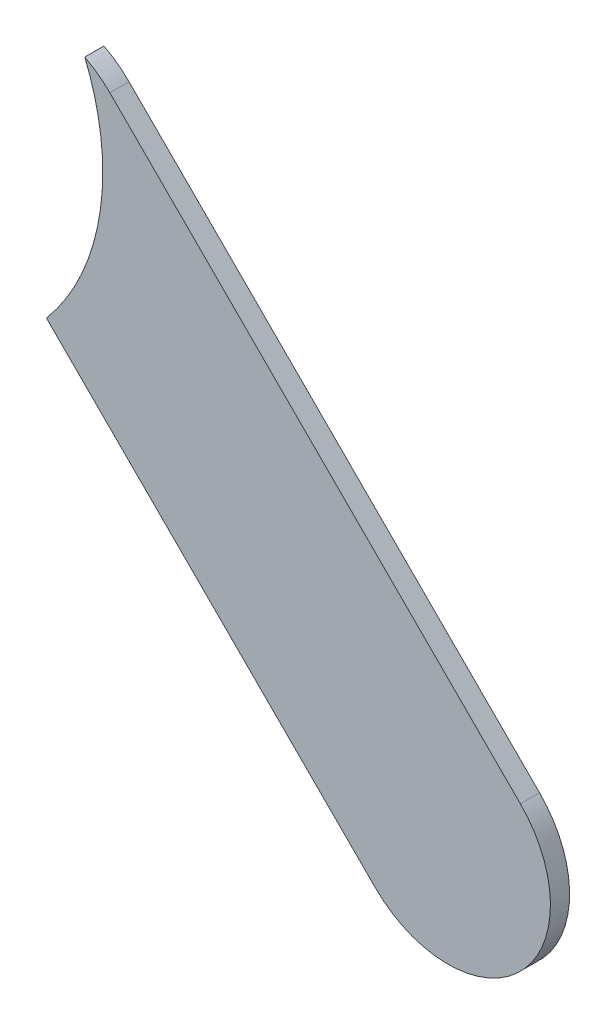
ISO-10303-21;
HEADER;
FILE_DESCRIPTION(('STEP AP214'),'2;1');
FILE_NAME('part.step','',(''),(''),'','','');
FILE_SCHEMA(('AUTOMOTIVE_DESIGN { 1 0 10303 214 1 1 1 1 }'));
ENDSEC;
DATA;
#1=APPLICATION_CONTEXT('core data for automotive mechanical design processes');
#2=APPLICATION_PROTOCOL_DEFINITION('international standard','automotive_design',2000,#1);
#3=PRODUCT_CONTEXT('',#1,'mechanical');
#4=PRODUCT('Part','Part','',(#3));
#5=PRODUCT_RELATED_PRODUCT_CATEGORY('part','',(#4));
#6=PRODUCT_DEFINITION_FORMATION('','',#4);
#7=PRODUCT_DEFINITION_CONTEXT('part definition',#1,'design');
#8=PRODUCT_DEFINITION('design','',#6,#7);
#9=PRODUCT_DEFINITION_SHAPE('','',#8);
#10=(LENGTH_UNIT() NAMED_UNIT(*) SI_UNIT(.MILLI.,.METRE.));
#11=(NAMED_UNIT(*) PLANE_ANGLE_UNIT() SI_UNIT($,.RADIAN.));
#12=(NAMED_UNIT(*) SI_UNIT($,.STERADIAN.) SOLID_ANGLE_UNIT());
#13=UNCERTAINTY_MEASURE_WITH_UNIT(LENGTH_MEASURE(1.E-05),#10,'distance_accuracy_value','');
#14=(GEOMETRIC_REPRESENTATION_CONTEXT(3) GLOBAL_UNCERTAINTY_ASSIGNED_CONTEXT((#13)) GLOBAL_UNIT_ASSIGNED_CONTEXT((#10,
#11,#12)) REPRESENTATION_CONTEXT('',''));
#15=CARTESIAN_POINT('',(0.,0.,0.));
#16=DIRECTION('',(0.,0.,1.));
#17=DIRECTION('',(1.,0.,0.));
#18=AXIS2_PLACEMENT_3D('',#15,#16,#17);
#19=CARTESIAN_POINT('',(5.588,13.208,0.));
#20=DIRECTION('',(0.,0.,-1.));
#21=DIRECTION('',(1.,0.,0.));
#22=AXIS2_PLACEMENT_3D('',#19,#20,#21);
#23=CYLINDRICAL_SURFACE('',#22,0.4445);
#24=DIRECTION('',(0.,0.,1.));
#25=VECTOR('',#24,1.);
#26=CARTESIAN_POINT('',(5.9279789859653,12.9216531140347,0.));
#27=LINE('',#26,#25);
#28=CARTESIAN_POINT('',(5.9279789859653,12.9216531140347,0.));
#29=VERTEX_POINT('',#28);
#30=CARTESIAN_POINT('',(5.9279789859653,12.9216531140347,0.03556));
#31=VERTEX_POINT('',#30);
#32=EDGE_CURVE('E11',#29,#31,#27,.T.);
#33=ORIENTED_EDGE('',*,*,#32,.T.);
#34=CARTESIAN_POINT('',(5.588,13.208,0.03556));
#35=DIRECTION('',(0.,0.,1.));
#36=DIRECTION('',(1.,0.,0.));
#37=AXIS2_PLACEMENT_3D('',#34,#35,#36);
#38=CIRCLE('',#37,0.4445);
#39=CARTESIAN_POINT('',(6.0325,13.208,0.03556));
#40=VERTEX_POINT('',#39);
#41=EDGE_CURVE('E23',#31,#40,#38,.T.);
#42=ORIENTED_EDGE('',*,*,#41,.T.);
#43=DIRECTION('',(0.,0.,1.));
#44=VECTOR('',#43,1.);
#45=CARTESIAN_POINT('',(6.0325,13.208,0.));
#46=LINE('',#45,#44);
#47=CARTESIAN_POINT('',(6.0325,13.208,0.));
#48=VERTEX_POINT('',#47);
#49=EDGE_CURVE('E112',#48,#40,#46,.T.);
#50=ORIENTED_EDGE('',*,*,#49,.F.);
#51=CARTESIAN_POINT('',(5.588,13.208,0.));
#52=DIRECTION('',(0.,0.,1.));
#53=DIRECTION('',(1.,0.,0.));
#54=AXIS2_PLACEMENT_3D('',#51,#52,#53);
#55=CIRCLE('',#54,0.4445);
#56=EDGE_CURVE('E110',#29,#48,#55,.T.);
#57=ORIENTED_EDGE('',*,*,#56,.F.);
#58=EDGE_LOOP('',(#33,#42,#50,#57));
#59=FACE_BOUND('',#58,.T.);
#60=ADVANCED_FACE('F16',(#59),#23,.F.);
#61=CARTESIAN_POINT('',(5.588,13.208,0.));
#62=DIRECTION('',(0.,0.,-1.));
#63=DIRECTION('',(1.,0.,0.));
#64=AXIS2_PLACEMENT_3D('',#61,#62,#63);
#65=CYLINDRICAL_SURFACE('',#64,0.4445);
#66=ORIENTED_EDGE('',*,*,#49,.T.);
#67=CARTESIAN_POINT('',(5.588,13.208,0.03556));
#68=DIRECTION('',(0.,0.,1.));
#69=DIRECTION('',(1.,0.,0.));
#70=AXIS2_PLACEMENT_3D('',#67,#68,#69);
#71=CIRCLE('',#70,0.4445);
#72=CARTESIAN_POINT('',(5.9991640960553,13.3768914921333,0.03556));
#73=VERTEX_POINT('',#72);
#74=EDGE_CURVE('E107',#40,#73,#71,.T.);
#75=ORIENTED_EDGE('',*,*,#74,.T.);
#76=DIRECTION('',(0.,0.,1.));
#77=VECTOR('',#76,1.);
#78=CARTESIAN_POINT('',(5.9991640960553,13.3768914921333,0.));
#79=LINE('',#78,#77);
#80=CARTESIAN_POINT('',(5.9991640960553,13.3768914921333,0.));
#81=VERTEX_POINT('',#80);
#82=EDGE_CURVE('E105',#81,#73,#79,.T.);
#83=ORIENTED_EDGE('',*,*,#82,.F.);
#84=EDGE_CURVE('E104',#48,#81,#55,.T.);
#85=ORIENTED_EDGE('',*,*,#84,.F.);
#86=EDGE_LOOP('',(#66,#75,#83,#85));
#87=FACE_BOUND('',#86,.T.);
#88=ADVANCED_FACE('F118',(#87),#65,.F.);
#89=CARTESIAN_POINT('',(5.91103974,13.208,0.));
#90=DIRECTION('',(0.,0.,-1.));
#91=DIRECTION('',(0.707106781186548,0.707106781186548,0.));
#92=AXIS2_PLACEMENT_3D('',#89,#90,#91);
#93=CYLINDRICAL_SURFACE('',#92,0.190499969147464);
#94=CARTESIAN_POINT('',(5.91103974,13.208,0.03556));
#95=DIRECTION('',(0.,0.,1.));
#96=DIRECTION('',(0.707106781186548,0.707106781186548,0.));
#97=AXIS2_PLACEMENT_3D('',#94,#95,#96);
#98=CIRCLE('',#97,0.190499969147464);
#99=CARTESIAN_POINT('',(6.04574356,13.34270382,0.03556));
#100=VERTEX_POINT('',#99);
#101=EDGE_CURVE('E101',#100,#73,#98,.T.);
#102=ORIENTED_EDGE('',*,*,#101,.F.);
#103=DIRECTION('',(0.,0.,1.));
#104=VECTOR('',#103,1.);
#105=CARTESIAN_POINT('',(6.04574356,13.34270382,0.));
#106=LINE('',#105,#104);
#107=CARTESIAN_POINT('',(6.04574356,13.34270382,0.));
#108=VERTEX_POINT('',#107);
#109=EDGE_CURVE('E99',#108,#100,#106,.T.);
#110=ORIENTED_EDGE('',*,*,#109,.F.);
#111=CARTESIAN_POINT('',(5.91103974,13.208,0.));
#112=DIRECTION('',(0.,0.,1.));
#113=DIRECTION('',(0.707106781186548,0.707106781186548,0.));
#114=AXIS2_PLACEMENT_3D('',#111,#112,#113);
#115=CIRCLE('',#114,0.190499969147464);
#116=EDGE_CURVE('E96',#108,#81,#115,.T.);
#117=ORIENTED_EDGE('',*,*,#116,.T.);
#118=ORIENTED_EDGE('',*,*,#82,.T.);
#119=EDGE_LOOP('',(#102,#110,#117,#118));
#120=FACE_BOUND('',#119,.T.);
#121=ADVANCED_FACE('F122',(#120),#93,.T.);
#122=CARTESIAN_POINT('',(6.80774356,12.58070382,0.));
#123=DIRECTION('',(-0.707106781186547,-0.707106781186548,0.));
#124=DIRECTION('',(-0.707106781186548,0.707106781186547,0.));
#125=AXIS2_PLACEMENT_3D('',#122,#123,#124);
#126=PLANE('',#125);
#127=DIRECTION('',(-0.707106781186548,0.707106781186547,0.));
#128=VECTOR('',#127,1.);
#129=CARTESIAN_POINT('',(6.80774356,12.58070382,0.03556));
#130=LINE('',#129,#128);
#131=CARTESIAN_POINT('',(6.80774356,12.58070382,0.03556));
#132=VERTEX_POINT('',#131);
#133=EDGE_CURVE('E93',#132,#100,#130,.T.);
#134=ORIENTED_EDGE('',*,*,#133,.F.);
#135=DIRECTION('',(0.,0.,1.));
#136=VECTOR('',#135,1.);
#137=CARTESIAN_POINT('',(6.80774356,12.58070382,0.));
#138=LINE('',#137,#136);
#139=CARTESIAN_POINT('',(6.80774356,12.58070382,0.));
#140=VERTEX_POINT('',#139);
#141=EDGE_CURVE('E91',#140,#132,#138,.T.);
#142=ORIENTED_EDGE('',*,*,#141,.F.);
#143=DIRECTION('',(-0.707106781186548,0.707106781186547,0.));
#144=VECTOR('',#143,1.);
#145=CARTESIAN_POINT('',(6.80774356,12.58070382,0.));
#146=LINE('',#145,#144);
#147=EDGE_CURVE('E82',#140,#108,#146,.T.);
#148=ORIENTED_EDGE('',*,*,#147,.T.);
#149=ORIENTED_EDGE('',*,*,#109,.T.);
#150=EDGE_LOOP('',(#134,#142,#148,#149));
#151=FACE_BOUND('',#150,.T.);
#152=ADVANCED_FACE('F125',(#151),#126,.F.);
#153=CARTESIAN_POINT('',(6.67303974,12.446,0.));
#154=DIRECTION('',(0.,0.,-1.));
#155=DIRECTION('',(-0.707106781186548,-0.707106781186548,0.));
#156=AXIS2_PLACEMENT_3D('',#153,#154,#155);
#157=CYLINDRICAL_SURFACE('',#156,0.190499969147464);
#158=CARTESIAN_POINT('',(6.67303974,12.446,0.03556));
#159=DIRECTION('',(0.,0.,1.));
#160=DIRECTION('',(-0.707106781186548,-0.707106781186548,0.));
#161=AXIS2_PLACEMENT_3D('',#158,#159,#160);
#162=CIRCLE('',#161,0.190499969147464);
#163=CARTESIAN_POINT('',(6.53833592,12.31129618,0.03556));
#164=VERTEX_POINT('',#163);
#165=EDGE_CURVE('E71',#164,#132,#162,.T.);
#166=ORIENTED_EDGE('',*,*,#165,.F.);
#167=DIRECTION('',(0.,0.,1.));
#168=VECTOR('',#167,1.);
#169=CARTESIAN_POINT('',(6.53833592,12.31129618,0.));
#170=LINE('',#169,#168);
#171=CARTESIAN_POINT('',(6.53833592,12.31129618,0.));
#172=VERTEX_POINT('',#171);
#173=EDGE_CURVE('E66',#172,#164,#170,.T.);
#174=ORIENTED_EDGE('',*,*,#173,.F.);
#175=CARTESIAN_POINT('',(6.67303974,12.446,0.));
#176=DIRECTION('',(0.,0.,1.));
#177=DIRECTION('',(-0.707106781186548,-0.707106781186548,0.));
#178=AXIS2_PLACEMENT_3D('',#175,#176,#177);
#179=CIRCLE('',#178,0.190499969147464);
#180=EDGE_CURVE('E69',#172,#140,#179,.T.);
#181=ORIENTED_EDGE('',*,*,#180,.T.);
#182=ORIENTED_EDGE('',*,*,#141,.T.);
#183=EDGE_LOOP('',(#166,#174,#181,#182));
#184=FACE_BOUND('',#183,.T.);
#185=ADVANCED_FACE('F68',(#184),#157,.T.);
#186=CARTESIAN_POINT('',(5.9279789859653,12.9216531140347,0.));
#187=DIRECTION('',(0.707106781186548,0.707106781186547,0.));
#188=DIRECTION('',(0.707106781186547,-0.707106781186548,0.));
#189=AXIS2_PLACEMENT_3D('',#186,#187,#188);
#190=PLANE('',#189);
#191=DIRECTION('',(0.707106781186547,-0.707106781186548,0.));
#192=VECTOR('',#191,1.);
#193=CARTESIAN_POINT('',(5.77633592,13.07329618,0.03556));
#194=LINE('',#193,#192);
#195=EDGE_CURVE('E83',#31,#164,#194,.T.);
#196=ORIENTED_EDGE('',*,*,#195,.F.);
#197=ORIENTED_EDGE('',*,*,#32,.F.);
#198=DIRECTION('',(0.707106781186547,-0.707106781186548,0.));
#199=VECTOR('',#198,1.);
#200=CARTESIAN_POINT('',(5.77633592,13.07329618,0.));
#201=LINE('',#200,#199);
#202=EDGE_CURVE('E79',#29,#172,#201,.T.);
#203=ORIENTED_EDGE('',*,*,#202,.T.);
#204=ORIENTED_EDGE('',*,*,#173,.T.);
#205=EDGE_LOOP('',(#196,#197,#203,#204));
#206=FACE_BOUND('',#205,.T.);
#207=ADVANCED_FACE('F85',(#206),#190,.F.);
#208=CARTESIAN_POINT('',(6.29203974,12.827,0.));
#209=DIRECTION('',(0.,0.,1.));
#210=DIRECTION('',(1.,0.,0.));
#211=AXIS2_PLACEMENT_3D('',#208,#209,#210);
#212=PLANE('',#211);
#213=ORIENTED_EDGE('',*,*,#202,.F.);
#214=ORIENTED_EDGE('',*,*,#56,.T.);
#215=ORIENTED_EDGE('',*,*,#84,.T.);
#216=ORIENTED_EDGE('',*,*,#116,.F.);
#217=ORIENTED_EDGE('',*,*,#147,.F.);
#218=ORIENTED_EDGE('',*,*,#180,.F.);
#219=EDGE_LOOP('',(#213,#214,#215,#216,#217,#218));
#220=FACE_BOUND('',#219,.T.);
#221=ADVANCED_FACE('F77',(#220),#212,.F.);
#222=CARTESIAN_POINT('',(6.29203974,12.827,0.03556));
#223=DIRECTION('',(0.,0.,1.));
#224=DIRECTION('',(1.,0.,0.));
#225=AXIS2_PLACEMENT_3D('',#222,#223,#224);
#226=PLANE('',#225);
#227=ORIENTED_EDGE('',*,*,#41,.F.);
#228=ORIENTED_EDGE('',*,*,#195,.T.);
#229=ORIENTED_EDGE('',*,*,#165,.T.);
#230=ORIENTED_EDGE('',*,*,#133,.T.);
#231=ORIENTED_EDGE('',*,*,#101,.T.);
#232=ORIENTED_EDGE('',*,*,#74,.F.);
#233=EDGE_LOOP('',(#227,#228,#229,#230,#231,#232));
#234=FACE_BOUND('',#233,.T.);
#235=ADVANCED_FACE('F115',(#234),#226,.T.);
#236=CLOSED_SHELL('',(#60,#88,#121,#152,#185,#207,#221,#235));
#237=MANIFOLD_SOLID_BREP('B1',#236);
#238=ADVANCED_BREP_SHAPE_REPRESENTATION('',(#18,#237),#14);
#239=SHAPE_DEFINITION_REPRESENTATION(#9,#238);
ENDSEC;
END-ISO-10303-21;
